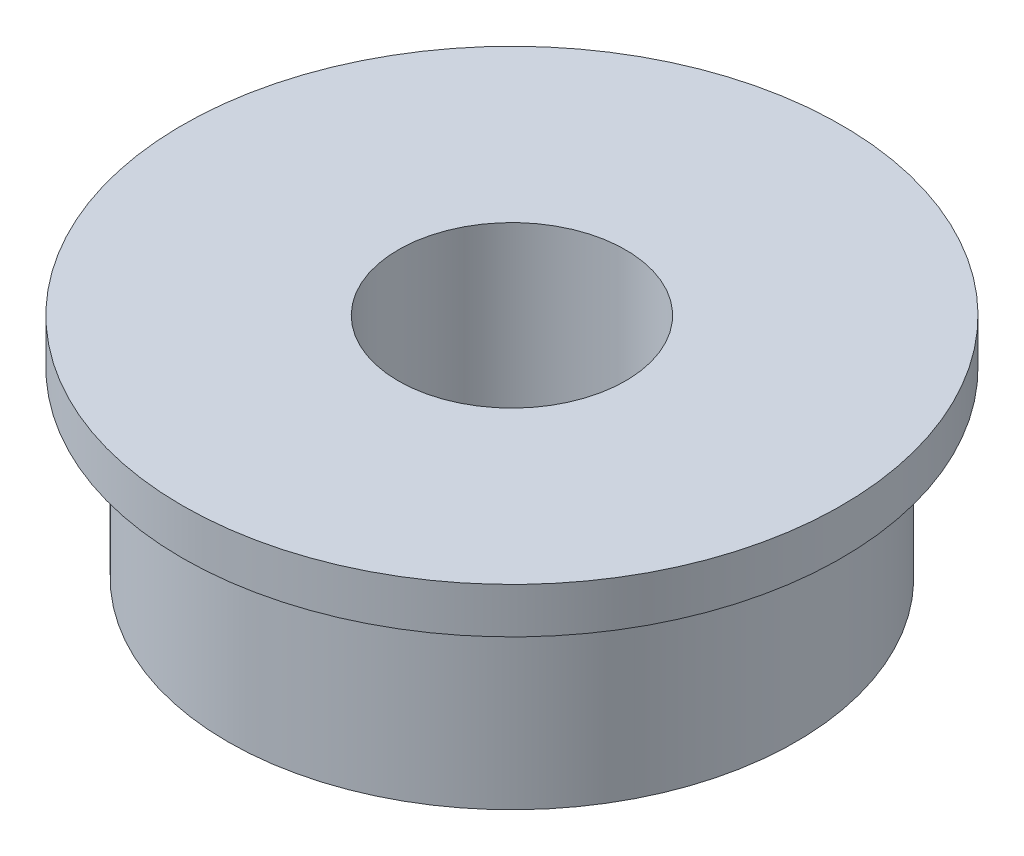
ISO-10303-21;
HEADER;
FILE_DESCRIPTION(('STEP AP214'),'2;1');
FILE_NAME('part.step','',(''),(''),'','','');
FILE_SCHEMA(('AUTOMOTIVE_DESIGN { 1 0 10303 214 1 1 1 1 }'));
ENDSEC;
DATA;
#1=APPLICATION_CONTEXT('core data for automotive mechanical design processes');
#2=APPLICATION_PROTOCOL_DEFINITION('international standard','automotive_design',2000,#1);
#3=PRODUCT_CONTEXT('',#1,'mechanical');
#4=PRODUCT('Part','Part','',(#3));
#5=PRODUCT_RELATED_PRODUCT_CATEGORY('part','',(#4));
#6=PRODUCT_DEFINITION_FORMATION('','',#4);
#7=PRODUCT_DEFINITION_CONTEXT('part definition',#1,'design');
#8=PRODUCT_DEFINITION('design','',#6,#7);
#9=PRODUCT_DEFINITION_SHAPE('','',#8);
#10=(LENGTH_UNIT() NAMED_UNIT(*) SI_UNIT(.MILLI.,.METRE.));
#11=(NAMED_UNIT(*) PLANE_ANGLE_UNIT() SI_UNIT($,.RADIAN.));
#12=(NAMED_UNIT(*) SI_UNIT($,.STERADIAN.) SOLID_ANGLE_UNIT());
#13=UNCERTAINTY_MEASURE_WITH_UNIT(LENGTH_MEASURE(1.E-05),#10,'distance_accuracy_value','');
#14=(GEOMETRIC_REPRESENTATION_CONTEXT(3) GLOBAL_UNCERTAINTY_ASSIGNED_CONTEXT((#13)) GLOBAL_UNIT_ASSIGNED_CONTEXT((#10,
#11,#12)) REPRESENTATION_CONTEXT('',''));
#15=CARTESIAN_POINT('',(0.,0.,0.));
#16=DIRECTION('',(0.,0.,1.));
#17=DIRECTION('',(1.,0.,0.));
#18=AXIS2_PLACEMENT_3D('',#15,#16,#17);
#19=CARTESIAN_POINT('',(0.,4.,0.));
#20=DIRECTION('',(0.,-1.,0.));
#21=DIRECTION('',(0.,0.,-1.));
#22=AXIS2_PLACEMENT_3D('',#19,#20,#21);
#23=CYLINDRICAL_SURFACE('',#22,5.);
#24=CARTESIAN_POINT('',(0.,0.,0.));
#25=DIRECTION('',(0.,1.,0.));
#26=DIRECTION('',(0.,0.,1.));
#27=AXIS2_PLACEMENT_3D('',#24,#25,#26);
#28=CIRCLE('',#27,5.);
#29=CARTESIAN_POINT('',(0.,0.,5.));
#30=VERTEX_POINT('',#29);
#31=EDGE_CURVE('E50',#30,#30,#28,.T.);
#32=ORIENTED_EDGE('',*,*,#31,.T.);
#33=EDGE_LOOP('',(#32));
#34=FACE_BOUND('',#33,.T.);
#35=CARTESIAN_POINT('',(0.,3.2,0.));
#36=DIRECTION('',(0.,1.,0.));
#37=DIRECTION('',(0.,0.,1.));
#38=AXIS2_PLACEMENT_3D('',#35,#36,#37);
#39=CIRCLE('',#38,5.);
#40=CARTESIAN_POINT('',(0.,3.2,5.));
#41=VERTEX_POINT('',#40);
#42=EDGE_CURVE('E10',#41,#41,#39,.T.);
#43=ORIENTED_EDGE('',*,*,#42,.F.);
#44=EDGE_LOOP('',(#43));
#45=FACE_BOUND('',#44,.T.);
#46=ADVANCED_FACE('F43',(#34,#45),#23,.T.);
#47=CARTESIAN_POINT('',(0.,4.,0.));
#48=DIRECTION('',(0.,1.,0.));
#49=DIRECTION('',(0.,0.,1.));
#50=AXIS2_PLACEMENT_3D('',#47,#48,#49);
#51=PLANE('',#50);
#52=CARTESIAN_POINT('',(0.,4.,0.));
#53=DIRECTION('',(0.,1.,0.));
#54=DIRECTION('',(0.,0.,1.));
#55=AXIS2_PLACEMENT_3D('',#52,#53,#54);
#56=CIRCLE('',#55,2.);
#57=CARTESIAN_POINT('',(0.,4.,2.));
#58=VERTEX_POINT('',#57);
#59=EDGE_CURVE('E55',#58,#58,#56,.T.);
#60=ORIENTED_EDGE('',*,*,#59,.F.);
#61=EDGE_LOOP('',(#60));
#62=FACE_BOUND('',#61,.T.);
#63=CARTESIAN_POINT('',(0.,4.,0.));
#64=DIRECTION('',(0.,1.,0.));
#65=DIRECTION('',(0.,0.,1.));
#66=AXIS2_PLACEMENT_3D('',#63,#64,#65);
#67=CIRCLE('',#66,5.8);
#68=CARTESIAN_POINT('',(0.,4.,5.8));
#69=VERTEX_POINT('',#68);
#70=EDGE_CURVE('E67',#69,#69,#67,.T.);
#71=ORIENTED_EDGE('',*,*,#70,.T.);
#72=EDGE_LOOP('',(#71));
#73=FACE_BOUND('',#72,.T.);
#74=ADVANCED_FACE('F87',(#62,#73),#51,.T.);
#75=CARTESIAN_POINT('',(0.,0.,0.));
#76=DIRECTION('',(0.,1.,0.));
#77=DIRECTION('',(0.,0.,1.));
#78=AXIS2_PLACEMENT_3D('',#75,#76,#77);
#79=PLANE('',#78);
#80=ORIENTED_EDGE('',*,*,#31,.F.);
#81=EDGE_LOOP('',(#80));
#82=FACE_BOUND('',#81,.T.);
#83=CARTESIAN_POINT('',(0.,0.,0.));
#84=DIRECTION('',(0.,1.,0.));
#85=DIRECTION('',(0.,0.,1.));
#86=AXIS2_PLACEMENT_3D('',#83,#84,#85);
#87=CIRCLE('',#86,2.);
#88=CARTESIAN_POINT('',(0.,0.,2.));
#89=VERTEX_POINT('',#88);
#90=EDGE_CURVE('E60',#89,#89,#87,.T.);
#91=ORIENTED_EDGE('',*,*,#90,.T.);
#92=EDGE_LOOP('',(#91));
#93=FACE_BOUND('',#92,.T.);
#94=ADVANCED_FACE('F92',(#82,#93),#79,.F.);
#95=CARTESIAN_POINT('',(0.,4.,0.));
#96=DIRECTION('',(0.,-1.,0.));
#97=DIRECTION('',(0.,0.,-1.));
#98=AXIS2_PLACEMENT_3D('',#95,#96,#97);
#99=CYLINDRICAL_SURFACE('',#98,2.);
#100=ORIENTED_EDGE('',*,*,#59,.T.);
#101=EDGE_LOOP('',(#100));
#102=FACE_BOUND('',#101,.T.);
#103=ORIENTED_EDGE('',*,*,#90,.F.);
#104=EDGE_LOOP('',(#103));
#105=FACE_BOUND('',#104,.T.);
#106=ADVANCED_FACE('F84',(#102,#105),#99,.F.);
#107=CARTESIAN_POINT('',(0.,3.2,0.));
#108=DIRECTION('',(0.,1.,0.));
#109=DIRECTION('',(0.,0.,1.));
#110=AXIS2_PLACEMENT_3D('',#107,#108,#109);
#111=CYLINDRICAL_SURFACE('',#110,5.8);
#112=CARTESIAN_POINT('',(0.,3.2,0.));
#113=DIRECTION('',(0.,1.,0.));
#114=DIRECTION('',(0.,0.,1.));
#115=AXIS2_PLACEMENT_3D('',#112,#113,#114);
#116=CIRCLE('',#115,5.8);
#117=CARTESIAN_POINT('',(0.,3.2,5.8));
#118=VERTEX_POINT('',#117);
#119=EDGE_CURVE('E65',#118,#118,#116,.T.);
#120=ORIENTED_EDGE('',*,*,#119,.T.);
#121=EDGE_LOOP('',(#120));
#122=FACE_BOUND('',#121,.T.);
#123=ORIENTED_EDGE('',*,*,#70,.F.);
#124=EDGE_LOOP('',(#123));
#125=FACE_BOUND('',#124,.T.);
#126=ADVANCED_FACE('F75',(#122,#125),#111,.T.);
#127=CARTESIAN_POINT('',(0.,3.2,0.));
#128=DIRECTION('',(0.,1.,0.));
#129=DIRECTION('',(0.,0.,1.));
#130=AXIS2_PLACEMENT_3D('',#127,#128,#129);
#131=PLANE('',#130);
#132=ORIENTED_EDGE('',*,*,#42,.T.);
#133=EDGE_LOOP('',(#132));
#134=FACE_BOUND('',#133,.T.);
#135=ORIENTED_EDGE('',*,*,#119,.F.);
#136=EDGE_LOOP('',(#135));
#137=FACE_BOUND('',#136,.T.);
#138=ADVANCED_FACE('F78',(#134,#137),#131,.F.);
#139=CLOSED_SHELL('',(#46,#74,#94,#106,#126,#138));
#140=MANIFOLD_SOLID_BREP('B2',#139);
#141=ADVANCED_BREP_SHAPE_REPRESENTATION('',(#18,#140),#14);
#142=SHAPE_DEFINITION_REPRESENTATION(#9,#141);
ENDSEC;
END-ISO-10303-21;
